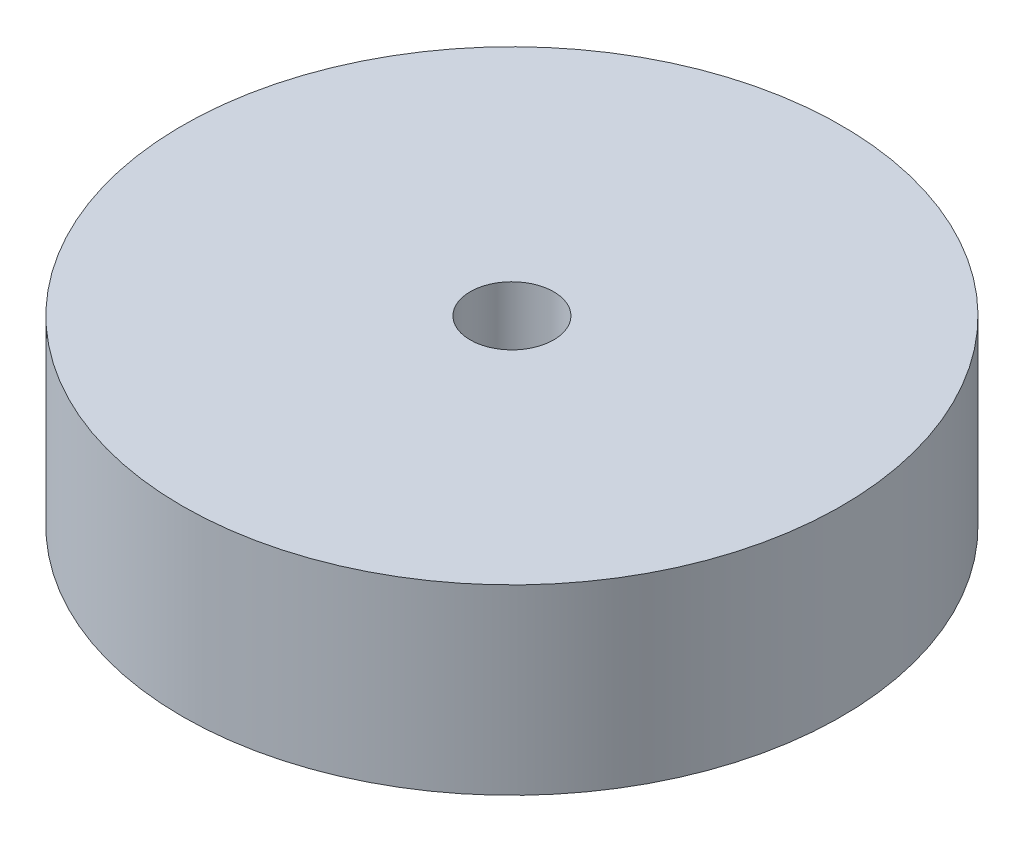
ISO-10303-21;
HEADER;
FILE_DESCRIPTION(('STEP AP214'),'2;1');
FILE_NAME('part.step','',(''),(''),'','','');
FILE_SCHEMA(('AUTOMOTIVE_DESIGN { 1 0 10303 214 1 1 1 1 }'));
ENDSEC;
DATA;
#1=APPLICATION_CONTEXT('core data for automotive mechanical design processes');
#2=APPLICATION_PROTOCOL_DEFINITION('international standard','automotive_design',2000,#1);
#3=PRODUCT_CONTEXT('',#1,'mechanical');
#4=PRODUCT('Part','Part','',(#3));
#5=PRODUCT_RELATED_PRODUCT_CATEGORY('part','',(#4));
#6=PRODUCT_DEFINITION_FORMATION('','',#4);
#7=PRODUCT_DEFINITION_CONTEXT('part definition',#1,'design');
#8=PRODUCT_DEFINITION('design','',#6,#7);
#9=PRODUCT_DEFINITION_SHAPE('','',#8);
#10=(LENGTH_UNIT() NAMED_UNIT(*) SI_UNIT(.MILLI.,.METRE.));
#11=(NAMED_UNIT(*) PLANE_ANGLE_UNIT() SI_UNIT($,.RADIAN.));
#12=(NAMED_UNIT(*) SI_UNIT($,.STERADIAN.) SOLID_ANGLE_UNIT());
#13=UNCERTAINTY_MEASURE_WITH_UNIT(LENGTH_MEASURE(1.E-05),#10,'distance_accuracy_value','');
#14=(GEOMETRIC_REPRESENTATION_CONTEXT(3) GLOBAL_UNCERTAINTY_ASSIGNED_CONTEXT((#13)) GLOBAL_UNIT_ASSIGNED_CONTEXT((#10,
#11,#12)) REPRESENTATION_CONTEXT('',''));
#15=CARTESIAN_POINT('',(0.,0.,0.));
#16=DIRECTION('',(0.,0.,1.));
#17=DIRECTION('',(1.,0.,0.));
#18=AXIS2_PLACEMENT_3D('',#15,#16,#17);
#19=CARTESIAN_POINT('',(0.,6.,0.));
#20=DIRECTION('',(0.,1.,0.));
#21=DIRECTION('',(0.,0.,1.));
#22=AXIS2_PLACEMENT_3D('',#19,#20,#21);
#23=PLANE('',#22);
#24=CARTESIAN_POINT('',(0.,6.,0.));
#25=DIRECTION('',(0.,1.,0.));
#26=DIRECTION('',(0.,0.,1.));
#27=AXIS2_PLACEMENT_3D('',#24,#25,#26);
#28=CIRCLE('',#27,10.85);
#29=CARTESIAN_POINT('',(0.,6.,10.85));
#30=VERTEX_POINT('',#29);
#31=EDGE_CURVE('E10',#30,#30,#28,.T.);
#32=ORIENTED_EDGE('',*,*,#31,.T.);
#33=EDGE_LOOP('',(#32));
#34=FACE_BOUND('',#33,.T.);
#35=CARTESIAN_POINT('',(0.,6.,0.));
#36=DIRECTION('',(0.,1.,0.));
#37=DIRECTION('',(0.,0.,1.));
#38=AXIS2_PLACEMENT_3D('',#35,#36,#37);
#39=CIRCLE('',#38,1.375);
#40=CARTESIAN_POINT('',(0.,6.,1.375));
#41=VERTEX_POINT('',#40);
#42=EDGE_CURVE('E42',#41,#41,#39,.T.);
#43=ORIENTED_EDGE('',*,*,#42,.F.);
#44=EDGE_LOOP('',(#43));
#45=FACE_BOUND('',#44,.T.);
#46=ADVANCED_FACE('F31',(#34,#45),#23,.T.);
#47=CARTESIAN_POINT('',(0.,0.,0.));
#48=DIRECTION('',(0.,1.,0.));
#49=DIRECTION('',(0.,0.,1.));
#50=AXIS2_PLACEMENT_3D('',#47,#48,#49);
#51=PLANE('',#50);
#52=CARTESIAN_POINT('',(0.,0.,0.));
#53=DIRECTION('',(0.,1.,0.));
#54=DIRECTION('',(0.,0.,1.));
#55=AXIS2_PLACEMENT_3D('',#52,#53,#54);
#56=CIRCLE('',#55,10.85);
#57=CARTESIAN_POINT('',(0.,0.,10.85));
#58=VERTEX_POINT('',#57);
#59=EDGE_CURVE('E35',#58,#58,#56,.T.);
#60=ORIENTED_EDGE('',*,*,#59,.F.);
#61=EDGE_LOOP('',(#60));
#62=FACE_BOUND('',#61,.T.);
#63=CARTESIAN_POINT('',(0.,0.,0.));
#64=DIRECTION('',(0.,1.,0.));
#65=DIRECTION('',(0.,0.,1.));
#66=AXIS2_PLACEMENT_3D('',#63,#64,#65);
#67=CIRCLE('',#66,1.375);
#68=CARTESIAN_POINT('',(0.,0.,1.375));
#69=VERTEX_POINT('',#68);
#70=EDGE_CURVE('E44',#69,#69,#67,.T.);
#71=ORIENTED_EDGE('',*,*,#70,.T.);
#72=EDGE_LOOP('',(#71));
#73=FACE_BOUND('',#72,.T.);
#74=ADVANCED_FACE('F54',(#62,#73),#51,.F.);
#75=CARTESIAN_POINT('',(0.,6.,0.));
#76=DIRECTION('',(0.,-1.,0.));
#77=DIRECTION('',(0.,0.,-1.));
#78=AXIS2_PLACEMENT_3D('',#75,#76,#77);
#79=CYLINDRICAL_SURFACE('',#78,10.85);
#80=ORIENTED_EDGE('',*,*,#31,.F.);
#81=EDGE_LOOP('',(#80));
#82=FACE_BOUND('',#81,.T.);
#83=ORIENTED_EDGE('',*,*,#59,.T.);
#84=EDGE_LOOP('',(#83));
#85=FACE_BOUND('',#84,.T.);
#86=ADVANCED_FACE('F33',(#82,#85),#79,.T.);
#87=CARTESIAN_POINT('',(0.,6.,0.));
#88=DIRECTION('',(0.,-1.,0.));
#89=DIRECTION('',(0.,0.,-1.));
#90=AXIS2_PLACEMENT_3D('',#87,#88,#89);
#91=CYLINDRICAL_SURFACE('',#90,1.375);
#92=ORIENTED_EDGE('',*,*,#42,.T.);
#93=EDGE_LOOP('',(#92));
#94=FACE_BOUND('',#93,.T.);
#95=ORIENTED_EDGE('',*,*,#70,.F.);
#96=EDGE_LOOP('',(#95));
#97=FACE_BOUND('',#96,.T.);
#98=ADVANCED_FACE('F50',(#94,#97),#91,.F.);
#99=CLOSED_SHELL('',(#46,#74,#86,#98));
#100=MANIFOLD_SOLID_BREP('B2',#99);
#101=ADVANCED_BREP_SHAPE_REPRESENTATION('',(#18,#100),#14);
#102=SHAPE_DEFINITION_REPRESENTATION(#9,#101);
ENDSEC;
END-ISO-10303-21;
